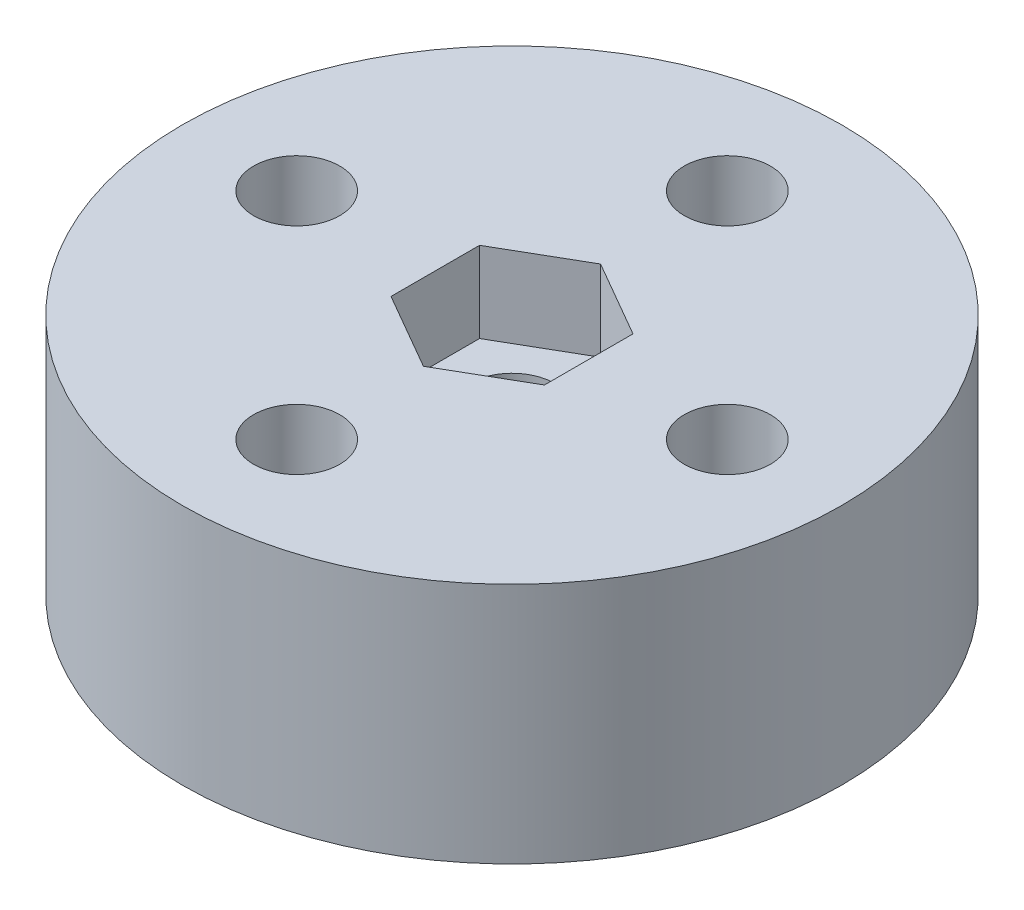
ISO-10303-21;
HEADER;
FILE_DESCRIPTION(('STEP AP214'),'2;1');
FILE_NAME('part.step','',(''),(''),'','','');
FILE_SCHEMA(('AUTOMOTIVE_DESIGN { 1 0 10303 214 1 1 1 1 }'));
ENDSEC;
DATA;
#1=APPLICATION_CONTEXT('core data for automotive mechanical design processes');
#2=APPLICATION_PROTOCOL_DEFINITION('international standard','automotive_design',2000,#1);
#3=PRODUCT_CONTEXT('',#1,'mechanical');
#4=PRODUCT('Part','Part','',(#3));
#5=PRODUCT_RELATED_PRODUCT_CATEGORY('part','',(#4));
#6=PRODUCT_DEFINITION_FORMATION('','',#4);
#7=PRODUCT_DEFINITION_CONTEXT('part definition',#1,'design');
#8=PRODUCT_DEFINITION('design','',#6,#7);
#9=PRODUCT_DEFINITION_SHAPE('','',#8);
#10=(LENGTH_UNIT() NAMED_UNIT(*) SI_UNIT(.MILLI.,.METRE.));
#11=(NAMED_UNIT(*) PLANE_ANGLE_UNIT() SI_UNIT($,.RADIAN.));
#12=(NAMED_UNIT(*) SI_UNIT($,.STERADIAN.) SOLID_ANGLE_UNIT());
#13=UNCERTAINTY_MEASURE_WITH_UNIT(LENGTH_MEASURE(1.E-05),#10,'distance_accuracy_value','');
#14=(GEOMETRIC_REPRESENTATION_CONTEXT(3) GLOBAL_UNCERTAINTY_ASSIGNED_CONTEXT((#13)) GLOBAL_UNIT_ASSIGNED_CONTEXT((#10,
#11,#12)) REPRESENTATION_CONTEXT('',''));
#15=CARTESIAN_POINT('',(0.,0.,0.));
#16=DIRECTION('',(0.,0.,1.));
#17=DIRECTION('',(1.,0.,0.));
#18=AXIS2_PLACEMENT_3D('',#15,#16,#17);
#19=CARTESIAN_POINT('',(0.,3.,0.));
#20=DIRECTION('',(0.,1.,0.));
#21=DIRECTION('',(0.,0.,1.));
#22=AXIS2_PLACEMENT_3D('',#19,#20,#21);
#23=PLANE('',#22);
#24=CARTESIAN_POINT('',(0.,3.,0.));
#25=DIRECTION('',(0.,1.,0.));
#26=DIRECTION('',(0.,0.,1.));
#27=AXIS2_PLACEMENT_3D('',#24,#25,#26);
#28=CIRCLE('',#27,1.6);
#29=CARTESIAN_POINT('',(0.,3.,1.6));
#30=VERTEX_POINT('',#29);
#31=EDGE_CURVE('E204',#30,#30,#28,.T.);
#32=ORIENTED_EDGE('',*,*,#31,.F.);
#33=EDGE_LOOP('',(#32));
#34=FACE_BOUND('',#33,.T.);
#35=DIRECTION('',(0.,0.,-1.));
#36=VECTOR('',#35,1.);
#37=CARTESIAN_POINT('',(-2.85,3.,0.));
#38=LINE('',#37,#36);
#39=CARTESIAN_POINT('',(-2.85,3.,1.64544826719043));
#40=VERTEX_POINT('',#39);
#41=CARTESIAN_POINT('',(-2.85,3.,-1.64544826719043));
#42=VERTEX_POINT('',#41);
#43=EDGE_CURVE('E170',#40,#42,#38,.T.);
#44=ORIENTED_EDGE('',*,*,#43,.F.);
#45=DIRECTION('',(-0.866025403784439,0.,-0.5));
#46=VECTOR('',#45,1.);
#47=CARTESIAN_POINT('',(-1.425,3.,2.46817240078565));
#48=LINE('',#47,#46);
#49=CARTESIAN_POINT('',(0.,3.,3.29089653438087));
#50=VERTEX_POINT('',#49);
#51=EDGE_CURVE('E142',#50,#40,#48,.T.);
#52=ORIENTED_EDGE('',*,*,#51,.F.);
#53=DIRECTION('',(-0.866025403784439,0.,0.5));
#54=VECTOR('',#53,1.);
#55=CARTESIAN_POINT('',(1.425,3.,2.46817240078565));
#56=LINE('',#55,#54);
#57=CARTESIAN_POINT('',(2.85,3.,1.64544826719043));
#58=VERTEX_POINT('',#57);
#59=EDGE_CURVE('E156',#58,#50,#56,.T.);
#60=ORIENTED_EDGE('',*,*,#59,.F.);
#61=DIRECTION('',(0.,0.,1.));
#62=VECTOR('',#61,1.);
#63=CARTESIAN_POINT('',(2.85,3.,0.));
#64=LINE('',#63,#62);
#65=CARTESIAN_POINT('',(2.85,3.,-1.64544826719043));
#66=VERTEX_POINT('',#65);
#67=EDGE_CURVE('E159',#66,#58,#64,.T.);
#68=ORIENTED_EDGE('',*,*,#67,.F.);
#69=DIRECTION('',(0.866025403784439,0.,0.5));
#70=VECTOR('',#69,1.);
#71=CARTESIAN_POINT('',(1.425,3.,-2.46817240078565));
#72=LINE('',#71,#70);
#73=CARTESIAN_POINT('',(0.,3.,-3.29089653438087));
#74=VERTEX_POINT('',#73);
#75=EDGE_CURVE('E175',#74,#66,#72,.T.);
#76=ORIENTED_EDGE('',*,*,#75,.F.);
#77=DIRECTION('',(0.866025403784439,0.,-0.5));
#78=VECTOR('',#77,1.);
#79=CARTESIAN_POINT('',(-1.425,3.,-2.46817240078565));
#80=LINE('',#79,#78);
#81=EDGE_CURVE('E172',#42,#74,#80,.T.);
#82=ORIENTED_EDGE('',*,*,#81,.F.);
#83=EDGE_LOOP('',(#44,#52,#60,#68,#76,#82));
#84=FACE_BOUND('',#83,.T.);
#85=ADVANCED_FACE('F84',(#34,#84),#23,.T.);
#86=CARTESIAN_POINT('',(0.,-3.,0.));
#87=DIRECTION('',(0.,1.,0.));
#88=DIRECTION('',(0.,0.,1.));
#89=AXIS2_PLACEMENT_3D('',#86,#87,#88);
#90=CYLINDRICAL_SURFACE('',#89,12.25);
#91=CARTESIAN_POINT('',(0.,-3.,0.));
#92=DIRECTION('',(0.,1.,0.));
#93=DIRECTION('',(0.,0.,1.));
#94=AXIS2_PLACEMENT_3D('',#91,#92,#93);
#95=CIRCLE('',#94,12.25);
#96=CARTESIAN_POINT('',(0.,-3.,12.25));
#97=VERTEX_POINT('',#96);
#98=EDGE_CURVE('E92',#97,#97,#95,.T.);
#99=ORIENTED_EDGE('',*,*,#98,.T.);
#100=EDGE_LOOP('',(#99));
#101=FACE_BOUND('',#100,.T.);
#102=CARTESIAN_POINT('',(0.,6.,0.));
#103=DIRECTION('',(0.,1.,0.));
#104=DIRECTION('',(0.,0.,1.));
#105=AXIS2_PLACEMENT_3D('',#102,#103,#104);
#106=CIRCLE('',#105,12.25);
#107=CARTESIAN_POINT('',(0.,6.,12.25));
#108=VERTEX_POINT('',#107);
#109=EDGE_CURVE('E201',#108,#108,#106,.T.);
#110=ORIENTED_EDGE('',*,*,#109,.F.);
#111=EDGE_LOOP('',(#110));
#112=FACE_BOUND('',#111,.T.);
#113=ADVANCED_FACE('F221',(#101,#112),#90,.T.);
#114=CARTESIAN_POINT('',(0.,-3.,-8.));
#115=DIRECTION('',(0.,1.,0.));
#116=DIRECTION('',(0.,0.,1.));
#117=AXIS2_PLACEMENT_3D('',#114,#115,#116);
#118=CYLINDRICAL_SURFACE('',#117,1.6);
#119=CARTESIAN_POINT('',(0.,-3.,-8.));
#120=DIRECTION('',(0.,1.,0.));
#121=DIRECTION('',(0.,0.,1.));
#122=AXIS2_PLACEMENT_3D('',#119,#120,#121);
#123=CIRCLE('',#122,1.6);
#124=CARTESIAN_POINT('',(0.,-3.,-6.4));
#125=VERTEX_POINT('',#124);
#126=EDGE_CURVE('E216',#125,#125,#123,.T.);
#127=ORIENTED_EDGE('',*,*,#126,.F.);
#128=EDGE_LOOP('',(#127));
#129=FACE_BOUND('',#128,.T.);
#130=CARTESIAN_POINT('',(0.,6.,-8.));
#131=DIRECTION('',(0.,1.,0.));
#132=DIRECTION('',(0.,0.,1.));
#133=AXIS2_PLACEMENT_3D('',#130,#131,#132);
#134=CIRCLE('',#133,1.6);
#135=CARTESIAN_POINT('',(0.,6.,-6.4));
#136=VERTEX_POINT('',#135);
#137=EDGE_CURVE('E198',#136,#136,#134,.T.);
#138=ORIENTED_EDGE('',*,*,#137,.T.);
#139=EDGE_LOOP('',(#138));
#140=FACE_BOUND('',#139,.T.);
#141=ADVANCED_FACE('F272',(#129,#140),#118,.F.);
#142=CARTESIAN_POINT('',(8.00000000000023,-3.,-2.26393958003914E-13));
#143=DIRECTION('',(0.,1.,0.));
#144=DIRECTION('',(0.,0.,1.));
#145=AXIS2_PLACEMENT_3D('',#142,#143,#144);
#146=CYLINDRICAL_SURFACE('',#145,1.60000000000018);
#147=CARTESIAN_POINT('',(8.00000000000023,-3.,-2.26393958003914E-13));
#148=DIRECTION('',(0.,1.,0.));
#149=DIRECTION('',(0.,0.,1.));
#150=AXIS2_PLACEMENT_3D('',#147,#148,#149);
#151=CIRCLE('',#150,1.60000000000018);
#152=CARTESIAN_POINT('',(8.00000000000023,-3.,1.59999999999995));
#153=VERTEX_POINT('',#152);
#154=EDGE_CURVE('E213',#153,#153,#151,.T.);
#155=ORIENTED_EDGE('',*,*,#154,.F.);
#156=EDGE_LOOP('',(#155));
#157=FACE_BOUND('',#156,.T.);
#158=CARTESIAN_POINT('',(8.00000000000023,6.,-2.26393958003914E-13));
#159=DIRECTION('',(0.,1.,0.));
#160=DIRECTION('',(0.,0.,1.));
#161=AXIS2_PLACEMENT_3D('',#158,#159,#160);
#162=CIRCLE('',#161,1.60000000000018);
#163=CARTESIAN_POINT('',(8.00000000000023,6.,1.59999999999995));
#164=VERTEX_POINT('',#163);
#165=EDGE_CURVE('E195',#164,#164,#162,.T.);
#166=ORIENTED_EDGE('',*,*,#165,.T.);
#167=EDGE_LOOP('',(#166));
#168=FACE_BOUND('',#167,.T.);
#169=ADVANCED_FACE('F275',(#157,#168),#146,.F.);
#170=CARTESIAN_POINT('',(4.52787916007828E-13,-3.,8.));
#171=DIRECTION('',(0.,1.,0.));
#172=DIRECTION('',(0.,0.,1.));
#173=AXIS2_PLACEMENT_3D('',#170,#171,#172);
#174=CYLINDRICAL_SURFACE('',#173,1.60000000000049);
#175=CARTESIAN_POINT('',(4.52787916007828E-13,-3.,8.));
#176=DIRECTION('',(0.,1.,0.));
#177=DIRECTION('',(0.,0.,1.));
#178=AXIS2_PLACEMENT_3D('',#175,#176,#177);
#179=CIRCLE('',#178,1.60000000000049);
#180=CARTESIAN_POINT('',(4.52787916007828E-13,-3.,9.60000000000049));
#181=VERTEX_POINT('',#180);
#182=EDGE_CURVE('E210',#181,#181,#179,.T.);
#183=ORIENTED_EDGE('',*,*,#182,.F.);
#184=EDGE_LOOP('',(#183));
#185=FACE_BOUND('',#184,.T.);
#186=CARTESIAN_POINT('',(4.52787916007828E-13,6.,8.));
#187=DIRECTION('',(0.,1.,0.));
#188=DIRECTION('',(0.,0.,1.));
#189=AXIS2_PLACEMENT_3D('',#186,#187,#188);
#190=CIRCLE('',#189,1.60000000000049);
#191=CARTESIAN_POINT('',(4.52787916007828E-13,6.,9.60000000000049));
#192=VERTEX_POINT('',#191);
#193=EDGE_CURVE('E192',#192,#192,#190,.T.);
#194=ORIENTED_EDGE('',*,*,#193,.T.);
#195=EDGE_LOOP('',(#194));
#196=FACE_BOUND('',#195,.T.);
#197=ADVANCED_FACE('F278',(#185,#196),#174,.F.);
#198=CARTESIAN_POINT('',(-7.99999999999977,-3.,2.27373675443232E-13));
#199=DIRECTION('',(0.,1.,0.));
#200=DIRECTION('',(0.,0.,1.));
#201=AXIS2_PLACEMENT_3D('',#198,#199,#200);
#202=CYLINDRICAL_SURFACE('',#201,1.60000000000036);
#203=CARTESIAN_POINT('',(-7.99999999999977,-3.,2.27373675443232E-13));
#204=DIRECTION('',(0.,1.,0.));
#205=DIRECTION('',(0.,0.,1.));
#206=AXIS2_PLACEMENT_3D('',#203,#204,#205);
#207=CIRCLE('',#206,1.60000000000036);
#208=CARTESIAN_POINT('',(-7.99999999999977,-3.,1.60000000000059));
#209=VERTEX_POINT('',#208);
#210=EDGE_CURVE('E207',#209,#209,#207,.T.);
#211=ORIENTED_EDGE('',*,*,#210,.F.);
#212=EDGE_LOOP('',(#211));
#213=FACE_BOUND('',#212,.T.);
#214=CARTESIAN_POINT('',(-7.99999999999977,6.,2.27373675443232E-13));
#215=DIRECTION('',(0.,1.,0.));
#216=DIRECTION('',(0.,0.,1.));
#217=AXIS2_PLACEMENT_3D('',#214,#215,#216);
#218=CIRCLE('',#217,1.60000000000036);
#219=CARTESIAN_POINT('',(-7.99999999999977,6.,1.60000000000059));
#220=VERTEX_POINT('',#219);
#221=EDGE_CURVE('E182',#220,#220,#218,.T.);
#222=ORIENTED_EDGE('',*,*,#221,.T.);
#223=EDGE_LOOP('',(#222));
#224=FACE_BOUND('',#223,.T.);
#225=ADVANCED_FACE('F86',(#213,#224),#202,.F.);
#226=CARTESIAN_POINT('',(0.,-3.,0.));
#227=DIRECTION('',(0.,1.,0.));
#228=DIRECTION('',(0.,0.,1.));
#229=AXIS2_PLACEMENT_3D('',#226,#227,#228);
#230=CYLINDRICAL_SURFACE('',#229,1.6);
#231=CARTESIAN_POINT('',(0.,-3.,0.));
#232=DIRECTION('',(0.,1.,0.));
#233=DIRECTION('',(0.,0.,1.));
#234=AXIS2_PLACEMENT_3D('',#231,#232,#233);
#235=CIRCLE('',#234,1.6);
#236=CARTESIAN_POINT('',(0.,-3.,1.6));
#237=VERTEX_POINT('',#236);
#238=EDGE_CURVE('E12',#237,#237,#235,.T.);
#239=ORIENTED_EDGE('',*,*,#238,.F.);
#240=EDGE_LOOP('',(#239));
#241=FACE_BOUND('',#240,.T.);
#242=ORIENTED_EDGE('',*,*,#31,.T.);
#243=EDGE_LOOP('',(#242));
#244=FACE_BOUND('',#243,.T.);
#245=ADVANCED_FACE('F227',(#241,#244),#230,.F.);
#246=CARTESIAN_POINT('',(0.,-3.,0.));
#247=DIRECTION('',(0.,1.,0.));
#248=DIRECTION('',(0.,0.,1.));
#249=AXIS2_PLACEMENT_3D('',#246,#247,#248);
#250=PLANE('',#249);
#251=ORIENTED_EDGE('',*,*,#210,.T.);
#252=EDGE_LOOP('',(#251));
#253=FACE_BOUND('',#252,.T.);
#254=ORIENTED_EDGE('',*,*,#182,.T.);
#255=EDGE_LOOP('',(#254));
#256=FACE_BOUND('',#255,.T.);
#257=ORIENTED_EDGE('',*,*,#154,.T.);
#258=EDGE_LOOP('',(#257));
#259=FACE_BOUND('',#258,.T.);
#260=ORIENTED_EDGE('',*,*,#126,.T.);
#261=EDGE_LOOP('',(#260));
#262=FACE_BOUND('',#261,.T.);
#263=ORIENTED_EDGE('',*,*,#98,.F.);
#264=EDGE_LOOP('',(#263));
#265=FACE_BOUND('',#264,.T.);
#266=ORIENTED_EDGE('',*,*,#238,.T.);
#267=EDGE_LOOP('',(#266));
#268=FACE_BOUND('',#267,.T.);
#269=ADVANCED_FACE('F224',(#253,#256,#259,#262,#265,#268),#250,.F.);
#270=CARTESIAN_POINT('',(0.,6.,0.));
#271=DIRECTION('',(0.,1.,0.));
#272=DIRECTION('',(0.,0.,1.));
#273=AXIS2_PLACEMENT_3D('',#270,#271,#272);
#274=PLANE('',#273);
#275=DIRECTION('',(-0.866025403784439,0.,-0.5));
#276=VECTOR('',#275,1.);
#277=CARTESIAN_POINT('',(-1.425,6.,2.46817240078565));
#278=LINE('',#277,#276);
#279=CARTESIAN_POINT('',(0.,6.,3.29089653438087));
#280=VERTEX_POINT('',#279);
#281=CARTESIAN_POINT('',(-2.85,6.,1.64544826719043));
#282=VERTEX_POINT('',#281);
#283=EDGE_CURVE('E139',#280,#282,#278,.T.);
#284=ORIENTED_EDGE('',*,*,#283,.T.);
#285=DIRECTION('',(0.,0.,-1.));
#286=VECTOR('',#285,1.);
#287=CARTESIAN_POINT('',(-2.85,6.,0.));
#288=LINE('',#287,#286);
#289=CARTESIAN_POINT('',(-2.85,6.,-1.64544826719043));
#290=VERTEX_POINT('',#289);
#291=EDGE_CURVE('E148',#282,#290,#288,.T.);
#292=ORIENTED_EDGE('',*,*,#291,.T.);
#293=DIRECTION('',(0.866025403784439,0.,-0.5));
#294=VECTOR('',#293,1.);
#295=CARTESIAN_POINT('',(-1.425,6.,-2.46817240078565));
#296=LINE('',#295,#294);
#297=CARTESIAN_POINT('',(0.,6.,-3.29089653438087));
#298=VERTEX_POINT('',#297);
#299=EDGE_CURVE('E107',#290,#298,#296,.T.);
#300=ORIENTED_EDGE('',*,*,#299,.T.);
#301=DIRECTION('',(0.866025403784439,0.,0.5));
#302=VECTOR('',#301,1.);
#303=CARTESIAN_POINT('',(1.425,6.,-2.46817240078565));
#304=LINE('',#303,#302);
#305=CARTESIAN_POINT('',(2.85,6.,-1.64544826719043));
#306=VERTEX_POINT('',#305);
#307=EDGE_CURVE('E163',#298,#306,#304,.T.);
#308=ORIENTED_EDGE('',*,*,#307,.T.);
#309=DIRECTION('',(0.,0.,1.));
#310=VECTOR('',#309,1.);
#311=CARTESIAN_POINT('',(2.85,6.,0.));
#312=LINE('',#311,#310);
#313=CARTESIAN_POINT('',(2.85,6.,1.64544826719043));
#314=VERTEX_POINT('',#313);
#315=EDGE_CURVE('E166',#306,#314,#312,.T.);
#316=ORIENTED_EDGE('',*,*,#315,.T.);
#317=DIRECTION('',(-0.866025403784439,0.,0.5));
#318=VECTOR('',#317,1.);
#319=CARTESIAN_POINT('',(1.425,6.,2.46817240078565));
#320=LINE('',#319,#318);
#321=EDGE_CURVE('E145',#314,#280,#320,.T.);
#322=ORIENTED_EDGE('',*,*,#321,.T.);
#323=EDGE_LOOP('',(#284,#292,#300,#308,#316,#322));
#324=FACE_BOUND('',#323,.T.);
#325=ORIENTED_EDGE('',*,*,#193,.F.);
#326=EDGE_LOOP('',(#325));
#327=FACE_BOUND('',#326,.T.);
#328=ORIENTED_EDGE('',*,*,#137,.F.);
#329=EDGE_LOOP('',(#328));
#330=FACE_BOUND('',#329,.T.);
#331=ORIENTED_EDGE('',*,*,#109,.T.);
#332=EDGE_LOOP('',(#331));
#333=FACE_BOUND('',#332,.T.);
#334=ORIENTED_EDGE('',*,*,#165,.F.);
#335=EDGE_LOOP('',(#334));
#336=FACE_BOUND('',#335,.T.);
#337=ORIENTED_EDGE('',*,*,#221,.F.);
#338=EDGE_LOOP('',(#337));
#339=FACE_BOUND('',#338,.T.);
#340=ADVANCED_FACE('F152',(#324,#327,#330,#333,#336,#339),#274,.T.);
#341=CARTESIAN_POINT('',(-1.425,6.,2.46817240078565));
#342=DIRECTION('',(-0.5,0.,0.866025403784439));
#343=DIRECTION('',(0.866025403784439,0.,0.5));
#344=AXIS2_PLACEMENT_3D('',#341,#342,#343);
#345=PLANE('',#344);
#346=ORIENTED_EDGE('',*,*,#51,.T.);
#347=DIRECTION('',(0.,-1.,0.));
#348=VECTOR('',#347,1.);
#349=CARTESIAN_POINT('',(-2.85,6.,1.64544826719043));
#350=LINE('',#349,#348);
#351=EDGE_CURVE('E99',#282,#40,#350,.T.);
#352=ORIENTED_EDGE('',*,*,#351,.F.);
#353=ORIENTED_EDGE('',*,*,#283,.F.);
#354=DIRECTION('',(0.,-1.,0.));
#355=VECTOR('',#354,1.);
#356=CARTESIAN_POINT('',(0.,6.,3.29089653438087));
#357=LINE('',#356,#355);
#358=EDGE_CURVE('E180',#280,#50,#357,.T.);
#359=ORIENTED_EDGE('',*,*,#358,.T.);
#360=EDGE_LOOP('',(#346,#352,#353,#359));
#361=FACE_BOUND('',#360,.T.);
#362=ADVANCED_FACE('F137',(#361),#345,.F.);
#363=CARTESIAN_POINT('',(1.425,6.,2.46817240078565));
#364=DIRECTION('',(0.5,0.,0.866025403784439));
#365=DIRECTION('',(0.866025403784439,0.,-0.5));
#366=AXIS2_PLACEMENT_3D('',#363,#364,#365);
#367=PLANE('',#366);
#368=ORIENTED_EDGE('',*,*,#59,.T.);
#369=ORIENTED_EDGE('',*,*,#358,.F.);
#370=ORIENTED_EDGE('',*,*,#321,.F.);
#371=DIRECTION('',(0.,-1.,0.));
#372=VECTOR('',#371,1.);
#373=CARTESIAN_POINT('',(2.85,6.,1.64544826719043));
#374=LINE('',#373,#372);
#375=EDGE_CURVE('E183',#314,#58,#374,.T.);
#376=ORIENTED_EDGE('',*,*,#375,.T.);
#377=EDGE_LOOP('',(#368,#369,#370,#376));
#378=FACE_BOUND('',#377,.T.);
#379=ADVANCED_FACE('F252',(#378),#367,.F.);
#380=CARTESIAN_POINT('',(2.85,6.,0.));
#381=DIRECTION('',(1.,0.,0.));
#382=DIRECTION('',(0.,0.,-1.));
#383=AXIS2_PLACEMENT_3D('',#380,#381,#382);
#384=PLANE('',#383);
#385=ORIENTED_EDGE('',*,*,#67,.T.);
#386=ORIENTED_EDGE('',*,*,#375,.F.);
#387=ORIENTED_EDGE('',*,*,#315,.F.);
#388=DIRECTION('',(0.,-1.,0.));
#389=VECTOR('',#388,1.);
#390=CARTESIAN_POINT('',(2.85,6.,-1.64544826719043));
#391=LINE('',#390,#389);
#392=EDGE_CURVE('E185',#306,#66,#391,.T.);
#393=ORIENTED_EDGE('',*,*,#392,.T.);
#394=EDGE_LOOP('',(#385,#386,#387,#393));
#395=FACE_BOUND('',#394,.T.);
#396=ADVANCED_FACE('F250',(#395),#384,.F.);
#397=CARTESIAN_POINT('',(1.425,6.,-2.46817240078565));
#398=DIRECTION('',(0.5,0.,-0.866025403784439));
#399=DIRECTION('',(-0.866025403784439,0.,-0.5));
#400=AXIS2_PLACEMENT_3D('',#397,#398,#399);
#401=PLANE('',#400);
#402=ORIENTED_EDGE('',*,*,#75,.T.);
#403=ORIENTED_EDGE('',*,*,#392,.F.);
#404=ORIENTED_EDGE('',*,*,#307,.F.);
#405=DIRECTION('',(0.,-1.,0.));
#406=VECTOR('',#405,1.);
#407=CARTESIAN_POINT('',(0.,6.,-3.29089653438087));
#408=LINE('',#407,#406);
#409=EDGE_CURVE('E187',#298,#74,#408,.T.);
#410=ORIENTED_EDGE('',*,*,#409,.T.);
#411=EDGE_LOOP('',(#402,#403,#404,#410));
#412=FACE_BOUND('',#411,.T.);
#413=ADVANCED_FACE('F247',(#412),#401,.F.);
#414=CARTESIAN_POINT('',(-1.425,6.,-2.46817240078565));
#415=DIRECTION('',(-0.5,0.,-0.866025403784439));
#416=DIRECTION('',(-0.866025403784439,0.,0.5));
#417=AXIS2_PLACEMENT_3D('',#414,#415,#416);
#418=PLANE('',#417);
#419=ORIENTED_EDGE('',*,*,#81,.T.);
#420=ORIENTED_EDGE('',*,*,#409,.F.);
#421=ORIENTED_EDGE('',*,*,#299,.F.);
#422=DIRECTION('',(0.,-1.,0.));
#423=VECTOR('',#422,1.);
#424=CARTESIAN_POINT('',(-2.85,6.,-1.64544826719043));
#425=LINE('',#424,#423);
#426=EDGE_CURVE('E144',#290,#42,#425,.T.);
#427=ORIENTED_EDGE('',*,*,#426,.T.);
#428=EDGE_LOOP('',(#419,#420,#421,#427));
#429=FACE_BOUND('',#428,.T.);
#430=ADVANCED_FACE('F244',(#429),#418,.F.);
#431=CARTESIAN_POINT('',(-2.85,6.,0.));
#432=DIRECTION('',(-1.,0.,0.));
#433=DIRECTION('',(0.,0.,1.));
#434=AXIS2_PLACEMENT_3D('',#431,#432,#433);
#435=PLANE('',#434);
#436=ORIENTED_EDGE('',*,*,#43,.T.);
#437=ORIENTED_EDGE('',*,*,#426,.F.);
#438=ORIENTED_EDGE('',*,*,#291,.F.);
#439=ORIENTED_EDGE('',*,*,#351,.T.);
#440=EDGE_LOOP('',(#436,#437,#438,#439));
#441=FACE_BOUND('',#440,.T.);
#442=ADVANCED_FACE('F149',(#441),#435,.F.);
#443=CLOSED_SHELL('',(#85,#113,#141,#169,#197,#225,#245,#269,#340,#362,#379,#396,#413,#430,#442));
#444=MANIFOLD_SOLID_BREP('B2',#443);
#445=ADVANCED_BREP_SHAPE_REPRESENTATION('',(#18,#444),#14);
#446=SHAPE_DEFINITION_REPRESENTATION(#9,#445);
ENDSEC;
END-ISO-10303-21;
